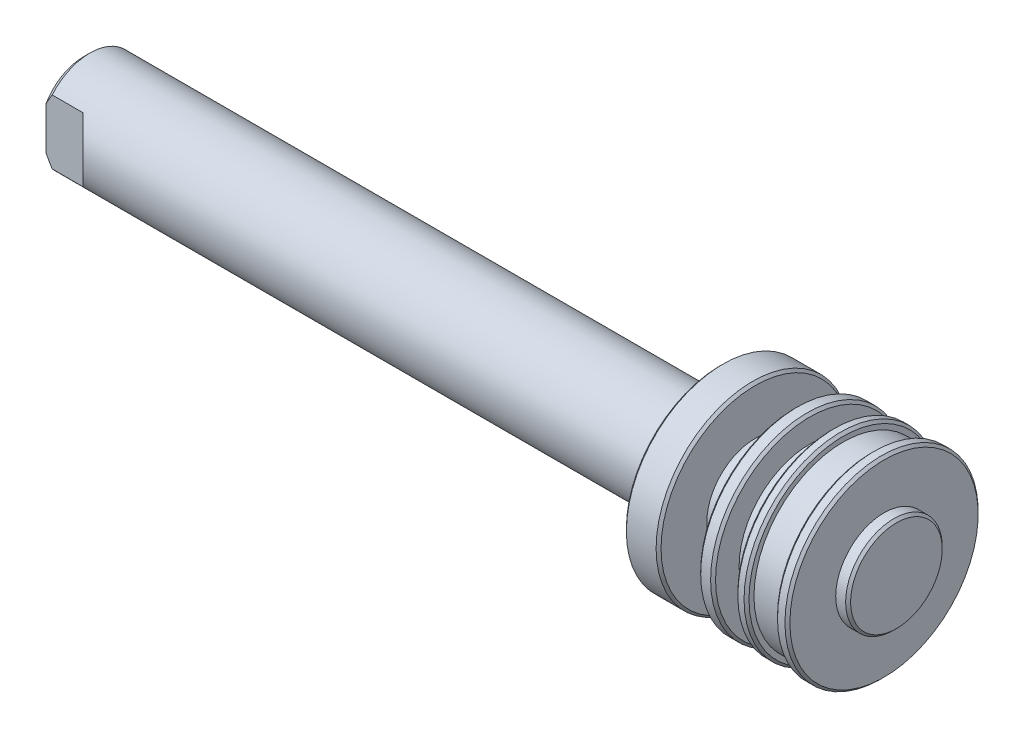
ISO-10303-21;
HEADER;
FILE_DESCRIPTION(('STEP AP214'),'2;1');
FILE_NAME('part.step','',(''),(''),'','','');
FILE_SCHEMA(('AUTOMOTIVE_DESIGN { 1 0 10303 214 1 1 1 1 }'));
ENDSEC;
DATA;
#1=APPLICATION_CONTEXT('core data for automotive mechanical design processes');
#2=APPLICATION_PROTOCOL_DEFINITION('international standard','automotive_design',2000,#1);
#3=PRODUCT_CONTEXT('',#1,'mechanical');
#4=PRODUCT('Part','Part','',(#3));
#5=PRODUCT_RELATED_PRODUCT_CATEGORY('part','',(#4));
#6=PRODUCT_DEFINITION_FORMATION('','',#4);
#7=PRODUCT_DEFINITION_CONTEXT('part definition',#1,'design');
#8=PRODUCT_DEFINITION('design','',#6,#7);
#9=PRODUCT_DEFINITION_SHAPE('','',#8);
#10=(LENGTH_UNIT() NAMED_UNIT(*) SI_UNIT(.MILLI.,.METRE.));
#11=(NAMED_UNIT(*) PLANE_ANGLE_UNIT() SI_UNIT($,.RADIAN.));
#12=(NAMED_UNIT(*) SI_UNIT($,.STERADIAN.) SOLID_ANGLE_UNIT());
#13=UNCERTAINTY_MEASURE_WITH_UNIT(LENGTH_MEASURE(1.E-05),#10,'distance_accuracy_value','');
#14=(GEOMETRIC_REPRESENTATION_CONTEXT(3) GLOBAL_UNCERTAINTY_ASSIGNED_CONTEXT((#13)) GLOBAL_UNIT_ASSIGNED_CONTEXT((#10,
#11,#12)) REPRESENTATION_CONTEXT('',''));
#15=CARTESIAN_POINT('',(0.,0.,0.));
#16=DIRECTION('',(0.,0.,1.));
#17=DIRECTION('',(1.,0.,0.));
#18=AXIS2_PLACEMENT_3D('',#15,#16,#17);
#19=CARTESIAN_POINT('',(0.5,0.,0.));
#20=DIRECTION('',(1.,0.,0.));
#21=DIRECTION('',(0.,0.,-1.));
#22=AXIS2_PLACEMENT_3D('',#19,#20,#21);
#23=CONICAL_SURFACE('',#22,4.,0.785398163397448);
#24=CARTESIAN_POINT('',(0.5,0.,0.));
#25=DIRECTION('',(-1.,0.,0.));
#26=DIRECTION('',(0.,0.,1.));
#27=AXIS2_PLACEMENT_3D('',#24,#25,#26);
#28=CIRCLE('',#27,4.);
#29=CARTESIAN_POINT('',(0.5,2.58795285892151,3.05));
#30=VERTEX_POINT('',#29);
#31=CARTESIAN_POINT('',(0.5,2.58795285892151,-3.05));
#32=VERTEX_POINT('',#31);
#33=EDGE_CURVE('E121',#30,#32,#28,.T.);
#34=ORIENTED_EDGE('',*,*,#33,.T.);
#35=CARTESIAN_POINT('',(5.30956586256442,8.26474141681761,-3.05));
#36=CARTESIAN_POINT('',(5.1887220072014,8.13592918825513,-3.05));
#37=CARTESIAN_POINT('',(5.06805590456024,8.00695029116973,-3.05));
#38=CARTESIAN_POINT('',(4.82713700916492,7.74860566830565,-3.05));
#39=CARTESIAN_POINT('',(4.70688421890468,7.61923994020161,-3.05));
#40=CARTESIAN_POINT('',(4.34668254667253,7.23032031117462,-3.05));
#41=CARTESIAN_POINT('',(4.10744372064438,6.97010714260211,-3.05));
#42=CARTESIAN_POINT('',(3.6261112271687,6.44136734403333,-3.05));
#43=CARTESIAN_POINT('',(3.38407702136471,6.17278651849577,-3.05));
#44=CARTESIAN_POINT('',(2.90395128456402,5.63236897410017,-3.05));
#45=CARTESIAN_POINT('',(2.66585766281513,5.36053412287958,-3.05));
#46=CARTESIAN_POINT('',(2.31305759431436,4.94914638399892,-3.05));
#47=CARTESIAN_POINT('',(2.19620240344148,4.81143730833098,-3.05));
#48=CARTESIAN_POINT('',(1.96429633510041,4.53451005363036,-3.05));
#49=CARTESIAN_POINT('',(1.84924541842636,4.39529190750042,-3.05));
#50=CARTESIAN_POINT('',(1.62122217730855,4.11474285751121,-3.05));
#51=CARTESIAN_POINT('',(1.50825396468045,3.97340860331652,-3.05));
#52=CARTESIAN_POINT('',(1.28529482129368,3.68841871284145,-3.05));
#53=CARTESIAN_POINT('',(1.17530367535827,3.54476324553896,-3.05));
#54=CARTESIAN_POINT('',(0.960215853154471,3.25580420295927,-3.05));
#55=CARTESIAN_POINT('',(0.855084309354178,3.1105267022285,-3.05));
#56=CARTESIAN_POINT('',(0.650011344775244,2.81624747105374,-3.05));
#57=CARTESIAN_POINT('',(0.550071770054458,2.66724444347886,-3.05));
#58=CARTESIAN_POINT('',(0.357760644144029,2.3650327263418,-3.05));
#59=CARTESIAN_POINT('',(0.265366949353805,2.21183824339981,-3.05));
#60=CARTESIAN_POINT('',(0.0909178818618186,1.89972186521963,-3.05));
#61=CARTESIAN_POINT('',(0.00885292811548895,1.74080545636814,-3.05));
#62=CARTESIAN_POINT('',(-0.10888824966213,1.48460423093103,-3.05));
#63=CARTESIAN_POINT('',(-0.149527231508398,1.38960764672698,-3.05));
#64=CARTESIAN_POINT('',(-0.224658879090396,1.19716828392364,-3.05));
#65=CARTESIAN_POINT('',(-0.259150663849781,1.09972515698105,-3.05));
#66=CARTESIAN_POINT('',(-0.32048596351761,0.903039491807728,-3.05));
#67=CARTESIAN_POINT('',(-0.34737197667197,0.803810385675026,-3.05));
#68=CARTESIAN_POINT('',(-0.392423615211038,0.603370922473285,-3.05));
#69=CARTESIAN_POINT('',(-0.410590228365179,0.502160791175531,-3.05));
#70=CARTESIAN_POINT('',(-0.437293875742596,0.296921109095727,-3.05));
#71=CARTESIAN_POINT('',(-0.445683831955525,0.192872010382581,-3.05));
#72=CARTESIAN_POINT('',(-0.451738886972855,-0.015532020052772,-3.05));
#73=CARTESIAN_POINT('',(-0.449405186963304,-0.119886916213197,-3.05));
#74=CARTESIAN_POINT('',(-0.434163616384527,-0.328142917325406,-3.05));
#75=CARTESIAN_POINT('',(-0.421221907885868,-0.432041498950139,-3.05));
#76=CARTESIAN_POINT('',(-0.385611014228022,-0.638154028171175,-3.05));
#77=CARTESIAN_POINT('',(-0.362938741525978,-0.740367430355252,-3.05));
#78=CARTESIAN_POINT('',(-0.300515697200884,-0.975090989055164,-3.05));
#79=CARTESIAN_POINT('',(-0.257616315421481,-1.10675758052918,-3.05));
#80=CARTESIAN_POINT('',(-0.160343187951011,-1.36574260352407,-3.05));
#81=CARTESIAN_POINT('',(-0.105963432616923,-1.49305871698072,-3.05));
#82=CARTESIAN_POINT('',(0.0121417829016161,-1.74504275639466,-3.05));
#83=CARTESIAN_POINT('',(0.0759687618859697,-1.86966253608835,-3.05));
#84=CARTESIAN_POINT('',(0.176680240883261,-2.05380294059511,-3.05));
#85=CARTESIAN_POINT('',(0.211074833355193,-2.11471109364415,-3.05));
#86=CARTESIAN_POINT('',(0.281315714507197,-2.23568154654843,-3.05));
#87=CARTESIAN_POINT('',(0.317161929863662,-2.29574388892078,-3.05));
#88=CARTESIAN_POINT('',(0.442625713747224,-2.50102337303096,-3.05));
#89=CARTESIAN_POINT('',(0.535355887995973,-2.64434046934043,-3.05));
#90=CARTESIAN_POINT('',(0.726222134731884,-2.92734432253532,-3.05));
#91=CARTESIAN_POINT('',(0.824359779428814,-3.06703000603559,-3.05));
#92=CARTESIAN_POINT('',(1.02472899255234,-3.34361521041407,-3.05));
#93=CARTESIAN_POINT('',(1.1269641842429,-3.48051209646423,-3.05));
#94=CARTESIAN_POINT('',(1.33448248137743,-3.75198214876369,-3.05));
#95=CARTESIAN_POINT('',(1.4397658184358,-3.88655513718389,-3.05));
#96=CARTESIAN_POINT('',(1.65312810266377,-4.15437191177198,-3.05));
#97=CARTESIAN_POINT('',(1.7612168044885,-4.28760790711467,-3.05));
#98=CARTESIAN_POINT('',(1.97927342309938,-4.55253520984487,-3.05));
#99=CARTESIAN_POINT('',(2.08924138879872,-4.68422647687552,-3.05));
#100=CARTESIAN_POINT('',(2.42125686291543,-5.07725906022321,-3.05));
#101=CARTESIAN_POINT('',(2.64553899162564,-5.33671172776797,-3.05));
#102=CARTESIAN_POINT('',(3.07144177080335,-5.82177568659465,-3.05));
#103=CARTESIAN_POINT('',(3.27262248447746,-6.04777570159472,-3.05));
#104=CARTESIAN_POINT('',(3.67730017858271,-6.4977550689543,-3.05));
#105=CARTESIAN_POINT('',(3.88079751655655,-6.72173409956867,-3.05));
#106=CARTESIAN_POINT('',(4.28779499659471,-7.16625348323241,-3.05));
#107=CARTESIAN_POINT('',(4.49128086968907,-7.38680692772714,-3.05));
#108=CARTESIAN_POINT('',(4.89953856942938,-7.82663982085206,-3.05));
#109=CARTESIAN_POINT('',(5.10431013366392,-8.04591951292631,-3.05));
#110=CARTESIAN_POINT('',(5.30956586256442,-8.26474141681761,-3.05));
#111=B_SPLINE_CURVE_WITH_KNOTS('',3,(#35,#36,#37,#38,#39,#40,#41,#42,#43,#44,#45,#46,#47,#48,
#49,#50,#51,#52,#53,#54,#55,#56,#57,#58,#59,#60,#61,#62,#63,#64,#65,#66,#67,#68,#69,#70,#71,#72,
#73,#74,#75,#76,#77,#78,#79,#80,#81,#82,#83,#84,#85,#86,#87,#88,#89,#90,#91,#92,#93,#94,#95,#96,
#97,#98,#99,#100,#101,#102,#103,#104,#105,#106,#107,#108,#109,#110),.UNSPECIFIED.,.F.,.F.,(4,2,
2,2,2,2,2,2,2,2,2,2,2,2,2,2,2,2,2,2,2,2,2,2,2,2,2,2,2,2,2,2,2,2,2,2,2,4),(0.,0.529869784554408,
1.05974276074664,2.12016049414461,3.20478023846264,4.28880477046128,4.8306145173731,
5.37241247470069,5.91518514336201,6.45791847611285,6.9958179420273,7.53390737270039,
8.07035634073656,8.60630396718082,8.91610909265289,9.22595858174228,9.53404091458944,
9.84208833836271,10.1547124660732,10.4673015767542,10.7808916973023,11.0945813947685,
11.5092899943203,11.9242162224943,12.3439774657782,12.5538079979439,12.7636279444488,
13.2755352885424,13.7875922620538,14.3001124693286,14.8126717233757,15.3273490695697,
15.8420398321721,16.8708335102401,17.7785331399435,18.6863748142993,19.5866207549675,
20.4866885687302),.UNSPECIFIED.);
#112=CARTESIAN_POINT('',(0.,1.71682847133894,-3.05));
#113=VERTEX_POINT('',#112);
#114=EDGE_CURVE('E106',#32,#113,#111,.T.);
#115=ORIENTED_EDGE('',*,*,#114,.T.);
#116=CARTESIAN_POINT('',(0.,0.,0.));
#117=DIRECTION('',(-1.,0.,0.));
#118=DIRECTION('',(0.,0.,1.));
#119=AXIS2_PLACEMENT_3D('',#116,#117,#118);
#120=CIRCLE('',#119,3.5);
#121=CARTESIAN_POINT('',(0.,1.71682847133894,3.05));
#122=VERTEX_POINT('',#121);
#123=EDGE_CURVE('E116',#122,#113,#120,.T.);
#124=ORIENTED_EDGE('',*,*,#123,.F.);
#125=CARTESIAN_POINT('',(5.30956586256442,-8.26474141681761,3.05));
#126=CARTESIAN_POINT('',(5.1887220072014,-8.13592918825513,3.05));
#127=CARTESIAN_POINT('',(5.06805590456024,-8.00695029116973,3.05));
#128=CARTESIAN_POINT('',(4.82713700916492,-7.74860566830565,3.05));
#129=CARTESIAN_POINT('',(4.70688421890468,-7.61923994020161,3.05));
#130=CARTESIAN_POINT('',(4.34668254667253,-7.23032031117462,3.05));
#131=CARTESIAN_POINT('',(4.10744372064438,-6.97010714260211,3.05));
#132=CARTESIAN_POINT('',(3.6261112271687,-6.44136734403333,3.05));
#133=CARTESIAN_POINT('',(3.38407702136471,-6.17278651849577,3.05));
#134=CARTESIAN_POINT('',(2.90395128456402,-5.63236897410017,3.05));
#135=CARTESIAN_POINT('',(2.66585766281513,-5.36053412287958,3.05));
#136=CARTESIAN_POINT('',(2.31305759431436,-4.94914638399892,3.05));
#137=CARTESIAN_POINT('',(2.19620240344148,-4.81143730833098,3.05));
#138=CARTESIAN_POINT('',(1.96429633510041,-4.53451005363036,3.05));
#139=CARTESIAN_POINT('',(1.84924541842636,-4.39529190750042,3.05));
#140=CARTESIAN_POINT('',(1.62122217730855,-4.11474285751121,3.05));
#141=CARTESIAN_POINT('',(1.50825396468045,-3.97340860331652,3.05));
#142=CARTESIAN_POINT('',(1.28529482129368,-3.68841871284145,3.05));
#143=CARTESIAN_POINT('',(1.17530367535827,-3.54476324553896,3.05));
#144=CARTESIAN_POINT('',(0.960215853154471,-3.25580420295927,3.05));
#145=CARTESIAN_POINT('',(0.855084309354178,-3.1105267022285,3.05));
#146=CARTESIAN_POINT('',(0.650011344775244,-2.81624747105374,3.05));
#147=CARTESIAN_POINT('',(0.550071770054458,-2.66724444347886,3.05));
#148=CARTESIAN_POINT('',(0.357760644144029,-2.3650327263418,3.05));
#149=CARTESIAN_POINT('',(0.265366949353805,-2.21183824339981,3.05));
#150=CARTESIAN_POINT('',(0.0909178818618186,-1.89972186521963,3.05));
#151=CARTESIAN_POINT('',(0.00885292811548895,-1.74080545636814,3.05));
#152=CARTESIAN_POINT('',(-0.10888824966213,-1.48460423093103,3.05));
#153=CARTESIAN_POINT('',(-0.149527231508398,-1.38960764672698,3.05));
#154=CARTESIAN_POINT('',(-0.224658879090396,-1.19716828392364,3.05));
#155=CARTESIAN_POINT('',(-0.259150663849781,-1.09972515698105,3.05));
#156=CARTESIAN_POINT('',(-0.32048596351761,-0.903039491807728,3.05));
#157=CARTESIAN_POINT('',(-0.34737197667197,-0.803810385675026,3.05));
#158=CARTESIAN_POINT('',(-0.392423615211038,-0.603370922473285,3.05));
#159=CARTESIAN_POINT('',(-0.410590228365179,-0.502160791175531,3.05));
#160=CARTESIAN_POINT('',(-0.437293875742596,-0.296921109095727,3.05));
#161=CARTESIAN_POINT('',(-0.445683831955525,-0.192872010382581,3.05));
#162=CARTESIAN_POINT('',(-0.451738886972855,0.015532020052772,3.05));
#163=CARTESIAN_POINT('',(-0.449405186963304,0.119886916213197,3.05));
#164=CARTESIAN_POINT('',(-0.434163616384527,0.328142917325406,3.05));
#165=CARTESIAN_POINT('',(-0.421221907885868,0.432041498950139,3.05));
#166=CARTESIAN_POINT('',(-0.385611014228022,0.638154028171175,3.05));
#167=CARTESIAN_POINT('',(-0.362938741525978,0.740367430355252,3.05));
#168=CARTESIAN_POINT('',(-0.300515697200884,0.975090989055164,3.05));
#169=CARTESIAN_POINT('',(-0.257616315421481,1.10675758052918,3.05));
#170=CARTESIAN_POINT('',(-0.160343187951011,1.36574260352407,3.05));
#171=CARTESIAN_POINT('',(-0.105963432616923,1.49305871698072,3.05));
#172=CARTESIAN_POINT('',(0.0121417829016161,1.74504275639466,3.05));
#173=CARTESIAN_POINT('',(0.0759687618859697,1.86966253608835,3.05));
#174=CARTESIAN_POINT('',(0.176680240883261,2.05380294059511,3.05));
#175=CARTESIAN_POINT('',(0.211074833355193,2.11471109364415,3.05));
#176=CARTESIAN_POINT('',(0.281315714507197,2.23568154654843,3.05));
#177=CARTESIAN_POINT('',(0.317161929863662,2.29574388892078,3.05));
#178=CARTESIAN_POINT('',(0.442625713747224,2.50102337303096,3.05));
#179=CARTESIAN_POINT('',(0.535355887995973,2.64434046934043,3.05));
#180=CARTESIAN_POINT('',(0.726222134731884,2.92734432253532,3.05));
#181=CARTESIAN_POINT('',(0.824359779428814,3.06703000603559,3.05));
#182=CARTESIAN_POINT('',(1.02472899255234,3.34361521041407,3.05));
#183=CARTESIAN_POINT('',(1.1269641842429,3.48051209646423,3.05));
#184=CARTESIAN_POINT('',(1.33448248137743,3.75198214876369,3.05));
#185=CARTESIAN_POINT('',(1.4397658184358,3.88655513718389,3.05));
#186=CARTESIAN_POINT('',(1.65312810266377,4.15437191177198,3.05));
#187=CARTESIAN_POINT('',(1.7612168044885,4.28760790711467,3.05));
#188=CARTESIAN_POINT('',(1.97927342309938,4.55253520984487,3.05));
#189=CARTESIAN_POINT('',(2.08924138879872,4.68422647687552,3.05));
#190=CARTESIAN_POINT('',(2.42125686291543,5.07725906022321,3.05));
#191=CARTESIAN_POINT('',(2.64553899162564,5.33671172776797,3.05));
#192=CARTESIAN_POINT('',(3.07144177080335,5.82177568659465,3.05));
#193=CARTESIAN_POINT('',(3.27262248447746,6.04777570159472,3.05));
#194=CARTESIAN_POINT('',(3.67730017858271,6.4977550689543,3.05));
#195=CARTESIAN_POINT('',(3.88079751655655,6.72173409956867,3.05));
#196=CARTESIAN_POINT('',(4.28779499659471,7.16625348323241,3.05));
#197=CARTESIAN_POINT('',(4.49128086968907,7.38680692772714,3.05));
#198=CARTESIAN_POINT('',(4.89953856942938,7.82663982085206,3.05));
#199=CARTESIAN_POINT('',(5.10431013366392,8.04591951292631,3.05));
#200=CARTESIAN_POINT('',(5.30956586256442,8.26474141681761,3.05));
#201=B_SPLINE_CURVE_WITH_KNOTS('',3,(#125,#126,#127,#128,#129,#130,#131,#132,#133,#134,#135,
#136,#137,#138,#139,#140,#141,#142,#143,#144,#145,#146,#147,#148,#149,#150,#151,#152,#153,#154,
#155,#156,#157,#158,#159,#160,#161,#162,#163,#164,#165,#166,#167,#168,#169,#170,#171,#172,#173,
#174,#175,#176,#177,#178,#179,#180,#181,#182,#183,#184,#185,#186,#187,#188,#189,#190,#191,#192,
#193,#194,#195,#196,#197,#198,#199,#200),.UNSPECIFIED.,.F.,.F.,(4,2,2,2,2,2,2,2,2,2,2,2,2,2,2,2,
2,2,2,2,2,2,2,2,2,2,2,2,2,2,2,2,2,2,2,2,2,4),(0.,0.529869784554408,1.05974276074664,
2.12016049414461,3.20478023846264,4.28880477046128,4.8306145173731,5.37241247470069,
5.91518514336201,6.45791847611285,6.9958179420273,7.53390737270039,8.07035634073656,
8.60630396718082,8.91610909265289,9.22595858174228,9.53404091458944,9.84208833836271,
10.1547124660732,10.4673015767542,10.7808916973023,11.0945813947685,11.5092899943203,
11.9242162224943,12.3439774657782,12.5538079979439,12.7636279444488,13.2755352885424,
13.7875922620538,14.3001124693286,14.8126717233757,15.3273490695697,15.8420398321721,
16.8708335102401,17.7785331399435,18.6863748142993,19.5866207549675,20.4866885687302),.UNSPECIFIED.);
#202=EDGE_CURVE('E144',#122,#30,#201,.T.);
#203=ORIENTED_EDGE('',*,*,#202,.T.);
#204=EDGE_LOOP('',(#34,#115,#124,#203));
#205=FACE_BOUND('',#204,.T.);
#206=ADVANCED_FACE('F41',(#205),#23,.T.);
#207=CARTESIAN_POINT('',(0.,0.,0.));
#208=DIRECTION('',(1.,0.,0.));
#209=DIRECTION('',(0.,0.,-1.));
#210=AXIS2_PLACEMENT_3D('',#207,#208,#209);
#211=PLANE('',#210);
#212=ORIENTED_EDGE('',*,*,#123,.T.);
#213=DIRECTION('',(0.,1.,0.));
#214=VECTOR('',#213,1.);
#215=CARTESIAN_POINT('',(0.,-8.,-3.05));
#216=LINE('',#215,#214);
#217=CARTESIAN_POINT('',(0.,-1.71682847133894,-3.05));
#218=VERTEX_POINT('',#217);
#219=EDGE_CURVE('E98',#218,#113,#216,.T.);
#220=ORIENTED_EDGE('',*,*,#219,.F.);
#221=CARTESIAN_POINT('',(0.,-1.71682847133894,3.05));
#222=VERTEX_POINT('',#221);
#223=EDGE_CURVE('E114',#218,#222,#120,.T.);
#224=ORIENTED_EDGE('',*,*,#223,.T.);
#225=DIRECTION('',(0.,1.,0.));
#226=VECTOR('',#225,1.);
#227=CARTESIAN_POINT('',(0.,-8.,3.05));
#228=LINE('',#227,#226);
#229=EDGE_CURVE('E117',#222,#122,#228,.T.);
#230=ORIENTED_EDGE('',*,*,#229,.T.);
#231=EDGE_LOOP('',(#212,#220,#224,#230));
#232=FACE_BOUND('',#231,.T.);
#233=CARTESIAN_POINT('',(0.,0.,0.));
#234=DIRECTION('',(-1.,0.,0.));
#235=DIRECTION('',(0.,-1.,0.));
#236=AXIS2_PLACEMENT_3D('',#233,#234,#235);
#237=CIRCLE('',#236,2.);
#238=CARTESIAN_POINT('',(0.,-2.,0.));
#239=VERTEX_POINT('',#238);
#240=EDGE_CURVE('E374',#239,#239,#237,.T.);
#241=ORIENTED_EDGE('',*,*,#240,.F.);
#242=EDGE_LOOP('',(#241));
#243=FACE_BOUND('',#242,.T.);
#244=ADVANCED_FACE('F43',(#232,#243),#211,.F.);
#245=ORIENTED_EDGE('',*,*,#223,.F.);
#246=CARTESIAN_POINT('',(0.5,-2.58795285892151,-3.05));
#247=VERTEX_POINT('',#246);
#248=EDGE_CURVE('E95',#218,#247,#111,.T.);
#249=ORIENTED_EDGE('',*,*,#248,.T.);
#250=CARTESIAN_POINT('',(0.5,-2.58795285892151,3.05));
#251=VERTEX_POINT('',#250);
#252=EDGE_CURVE('E125',#247,#251,#28,.T.);
#253=ORIENTED_EDGE('',*,*,#252,.T.);
#254=EDGE_CURVE('E107',#251,#222,#201,.T.);
#255=ORIENTED_EDGE('',*,*,#254,.T.);
#256=EDGE_LOOP('',(#245,#249,#253,#255));
#257=FACE_BOUND('',#256,.T.);
#258=ADVANCED_FACE('F120',(#257),#23,.T.);
#259=CARTESIAN_POINT('',(65.6,0.,0.));
#260=DIRECTION('',(-1.,0.,0.));
#261=DIRECTION('',(0.,0.,1.));
#262=AXIS2_PLACEMENT_3D('',#259,#260,#261);
#263=CYLINDRICAL_SURFACE('',#262,4.);
#264=CARTESIAN_POINT('',(-0.0499999999999945,0.,0.));
#265=DIRECTION('',(0.707106781186547,0.,0.707106781186547));
#266=DIRECTION('',(-0.707106781186548,0.,0.707106781186548));
#267=AXIS2_PLACEMENT_3D('',#264,#265,#266);
#268=ELLIPSE('',#267,5.65685424949238,4.);
#269=CARTESIAN_POINT('',(3.,-2.58795285892151,-3.05));
#270=VERTEX_POINT('',#269);
#271=CARTESIAN_POINT('',(3.,2.58795285892151,-3.05));
#272=VERTEX_POINT('',#271);
#273=EDGE_CURVE('E49',#270,#272,#268,.T.);
#274=ORIENTED_EDGE('',*,*,#273,.T.);
#275=DIRECTION('',(-1.,0.,0.));
#276=VECTOR('',#275,1.);
#277=CARTESIAN_POINT('',(65.6,2.58795285892151,-3.05));
#278=LINE('',#277,#276);
#279=EDGE_CURVE('E11',#272,#32,#278,.T.);
#280=ORIENTED_EDGE('',*,*,#279,.T.);
#281=ORIENTED_EDGE('',*,*,#33,.F.);
#282=DIRECTION('',(-1.,0.,0.));
#283=VECTOR('',#282,1.);
#284=CARTESIAN_POINT('',(65.6,2.58795285892151,3.05));
#285=LINE('',#284,#283);
#286=CARTESIAN_POINT('',(3.,2.58795285892151,3.05));
#287=VERTEX_POINT('',#286);
#288=EDGE_CURVE('E131',#30,#287,#285,.F.);
#289=ORIENTED_EDGE('',*,*,#288,.T.);
#290=CARTESIAN_POINT('',(-0.0499999999999945,0.,0.));
#291=DIRECTION('',(0.707106781186547,0.,-0.707106781186548));
#292=DIRECTION('',(-0.707106781186548,0.,-0.707106781186547));
#293=AXIS2_PLACEMENT_3D('',#290,#291,#292);
#294=ELLIPSE('',#293,5.65685424949238,4.);
#295=CARTESIAN_POINT('',(3.,-2.58795285892151,3.05));
#296=VERTEX_POINT('',#295);
#297=EDGE_CURVE('E123',#287,#296,#294,.T.);
#298=ORIENTED_EDGE('',*,*,#297,.T.);
#299=DIRECTION('',(-1.,0.,0.));
#300=VECTOR('',#299,1.);
#301=CARTESIAN_POINT('',(65.6,-2.58795285892151,3.05));
#302=LINE('',#301,#300);
#303=EDGE_CURVE('E134',#296,#251,#302,.T.);
#304=ORIENTED_EDGE('',*,*,#303,.T.);
#305=ORIENTED_EDGE('',*,*,#252,.F.);
#306=DIRECTION('',(-1.,0.,0.));
#307=VECTOR('',#306,1.);
#308=CARTESIAN_POINT('',(65.6,-2.58795285892151,-3.05));
#309=LINE('',#308,#307);
#310=EDGE_CURVE('E101',#247,#270,#309,.F.);
#311=ORIENTED_EDGE('',*,*,#310,.T.);
#312=EDGE_LOOP('',(#274,#280,#281,#289,#298,#304,#305,#311));
#313=FACE_BOUND('',#312,.T.);
#314=CARTESIAN_POINT('',(51.4,0.,0.));
#315=DIRECTION('',(-1.,0.,0.));
#316=DIRECTION('',(0.,0.,1.));
#317=AXIS2_PLACEMENT_3D('',#314,#315,#316);
#318=CIRCLE('',#317,4.);
#319=CARTESIAN_POINT('',(51.4,0.,4.));
#320=VERTEX_POINT('',#319);
#321=EDGE_CURVE('E295',#320,#320,#318,.T.);
#322=ORIENTED_EDGE('',*,*,#321,.T.);
#323=EDGE_LOOP('',(#322));
#324=FACE_BOUND('',#323,.T.);
#325=ADVANCED_FACE('F139',(#313,#324),#263,.T.);
#326=CARTESIAN_POINT('',(51.4,4.,0.));
#327=DIRECTION('',(1.,0.,0.));
#328=DIRECTION('',(0.,0.,-1.));
#329=AXIS2_PLACEMENT_3D('',#326,#327,#328);
#330=PLANE('',#329);
#331=ORIENTED_EDGE('',*,*,#321,.F.);
#332=EDGE_LOOP('',(#331));
#333=FACE_BOUND('',#332,.T.);
#334=CARTESIAN_POINT('',(51.4,0.,0.));
#335=DIRECTION('',(-1.,0.,0.));
#336=DIRECTION('',(0.,0.,1.));
#337=AXIS2_PLACEMENT_3D('',#334,#335,#336);
#338=CIRCLE('',#337,7.6);
#339=CARTESIAN_POINT('',(51.4,0.,7.6));
#340=VERTEX_POINT('',#339);
#341=EDGE_CURVE('E297',#340,#340,#338,.T.);
#342=ORIENTED_EDGE('',*,*,#341,.T.);
#343=EDGE_LOOP('',(#342));
#344=FACE_BOUND('',#343,.T.);
#345=ADVANCED_FACE('F282',(#333,#344),#330,.F.);
#346=CARTESIAN_POINT('',(51.6,0.,0.));
#347=DIRECTION('',(1.,0.,0.));
#348=DIRECTION('',(0.,0.,-1.));
#349=AXIS2_PLACEMENT_3D('',#346,#347,#348);
#350=CONICAL_SURFACE('',#349,7.8,0.78539816339745);
#351=ORIENTED_EDGE('',*,*,#341,.F.);
#352=EDGE_LOOP('',(#351));
#353=FACE_BOUND('',#352,.T.);
#354=CARTESIAN_POINT('',(51.6,0.,0.));
#355=DIRECTION('',(-1.,0.,0.));
#356=DIRECTION('',(0.,0.,1.));
#357=AXIS2_PLACEMENT_3D('',#354,#355,#356);
#358=CIRCLE('',#357,7.8);
#359=CARTESIAN_POINT('',(51.6,0.,7.8));
#360=VERTEX_POINT('',#359);
#361=EDGE_CURVE('E300',#360,#360,#358,.T.);
#362=ORIENTED_EDGE('',*,*,#361,.T.);
#363=EDGE_LOOP('',(#362));
#364=FACE_BOUND('',#363,.T.);
#365=ADVANCED_FACE('F278',(#353,#364),#350,.T.);
#366=CARTESIAN_POINT('',(65.6,0.,0.));
#367=DIRECTION('',(-1.,0.,0.));
#368=DIRECTION('',(0.,0.,1.));
#369=AXIS2_PLACEMENT_3D('',#366,#367,#368);
#370=CYLINDRICAL_SURFACE('',#369,7.8);
#371=ORIENTED_EDGE('',*,*,#361,.F.);
#372=EDGE_LOOP('',(#371));
#373=FACE_BOUND('',#372,.T.);
#374=CARTESIAN_POINT('',(54.,0.,0.));
#375=DIRECTION('',(-1.,0.,0.));
#376=DIRECTION('',(0.,0.,1.));
#377=AXIS2_PLACEMENT_3D('',#374,#375,#376);
#378=CIRCLE('',#377,7.8);
#379=CARTESIAN_POINT('',(54.,0.,7.8));
#380=VERTEX_POINT('',#379);
#381=EDGE_CURVE('E305',#380,#380,#378,.T.);
#382=ORIENTED_EDGE('',*,*,#381,.T.);
#383=EDGE_LOOP('',(#382));
#384=FACE_BOUND('',#383,.T.);
#385=ADVANCED_FACE('F274',(#373,#384),#370,.T.);
#386=CARTESIAN_POINT('',(54.2,0.,0.));
#387=DIRECTION('',(-1.,0.,0.));
#388=DIRECTION('',(0.,0.,1.));
#389=AXIS2_PLACEMENT_3D('',#386,#387,#388);
#390=CONICAL_SURFACE('',#389,7.6,0.785398163397433);
#391=ORIENTED_EDGE('',*,*,#381,.F.);
#392=EDGE_LOOP('',(#391));
#393=FACE_BOUND('',#392,.T.);
#394=CARTESIAN_POINT('',(54.2,0.,0.));
#395=DIRECTION('',(-1.,0.,0.));
#396=DIRECTION('',(0.,0.,1.));
#397=AXIS2_PLACEMENT_3D('',#394,#395,#396);
#398=CIRCLE('',#397,7.6);
#399=CARTESIAN_POINT('',(54.2,0.,7.6));
#400=VERTEX_POINT('',#399);
#401=EDGE_CURVE('E308',#400,#400,#398,.T.);
#402=ORIENTED_EDGE('',*,*,#401,.T.);
#403=EDGE_LOOP('',(#402));
#404=FACE_BOUND('',#403,.T.);
#405=ADVANCED_FACE('F270',(#393,#404),#390,.T.);
#406=CARTESIAN_POINT('',(54.2,7.6,0.));
#407=DIRECTION('',(-1.,0.,0.));
#408=DIRECTION('',(0.,0.,1.));
#409=AXIS2_PLACEMENT_3D('',#406,#407,#408);
#410=PLANE('',#409);
#411=ORIENTED_EDGE('',*,*,#401,.F.);
#412=EDGE_LOOP('',(#411));
#413=FACE_BOUND('',#412,.T.);
#414=CARTESIAN_POINT('',(54.2,0.,0.));
#415=DIRECTION('',(-1.,0.,0.));
#416=DIRECTION('',(0.,0.,1.));
#417=AXIS2_PLACEMENT_3D('',#414,#415,#416);
#418=CIRCLE('',#417,3.9);
#419=CARTESIAN_POINT('',(54.2,0.,3.9));
#420=VERTEX_POINT('',#419);
#421=EDGE_CURVE('E311',#420,#420,#418,.T.);
#422=ORIENTED_EDGE('',*,*,#421,.T.);
#423=EDGE_LOOP('',(#422));
#424=FACE_BOUND('',#423,.T.);
#425=ADVANCED_FACE('F266',(#413,#424),#410,.F.);
#426=CARTESIAN_POINT('',(65.6,0.,0.));
#427=DIRECTION('',(-1.,0.,0.));
#428=DIRECTION('',(0.,0.,1.));
#429=AXIS2_PLACEMENT_3D('',#426,#427,#428);
#430=CYLINDRICAL_SURFACE('',#429,3.9);
#431=ORIENTED_EDGE('',*,*,#421,.F.);
#432=EDGE_LOOP('',(#431));
#433=FACE_BOUND('',#432,.T.);
#434=CARTESIAN_POINT('',(57.4,0.,0.));
#435=DIRECTION('',(-1.,0.,0.));
#436=DIRECTION('',(0.,0.,1.));
#437=AXIS2_PLACEMENT_3D('',#434,#435,#436);
#438=CIRCLE('',#437,3.9);
#439=CARTESIAN_POINT('',(57.4,0.,3.9));
#440=VERTEX_POINT('',#439);
#441=EDGE_CURVE('E314',#440,#440,#438,.T.);
#442=ORIENTED_EDGE('',*,*,#441,.T.);
#443=EDGE_LOOP('',(#442));
#444=FACE_BOUND('',#443,.T.);
#445=ADVANCED_FACE('F262',(#433,#444),#430,.T.);
#446=CARTESIAN_POINT('',(57.4,3.9,0.));
#447=DIRECTION('',(1.,0.,0.));
#448=DIRECTION('',(0.,0.,-1.));
#449=AXIS2_PLACEMENT_3D('',#446,#447,#448);
#450=PLANE('',#449);
#451=ORIENTED_EDGE('',*,*,#441,.F.);
#452=EDGE_LOOP('',(#451));
#453=FACE_BOUND('',#452,.T.);
#454=CARTESIAN_POINT('',(57.4,0.,0.));
#455=DIRECTION('',(-1.,0.,0.));
#456=DIRECTION('',(0.,0.,1.));
#457=AXIS2_PLACEMENT_3D('',#454,#455,#456);
#458=CIRCLE('',#457,7.6);
#459=CARTESIAN_POINT('',(57.4,0.,7.6));
#460=VERTEX_POINT('',#459);
#461=EDGE_CURVE('E317',#460,#460,#458,.T.);
#462=ORIENTED_EDGE('',*,*,#461,.T.);
#463=EDGE_LOOP('',(#462));
#464=FACE_BOUND('',#463,.T.);
#465=ADVANCED_FACE('F258',(#453,#464),#450,.F.);
#466=CARTESIAN_POINT('',(57.6,0.,0.));
#467=DIRECTION('',(1.,0.,0.));
#468=DIRECTION('',(0.,0.,-1.));
#469=AXIS2_PLACEMENT_3D('',#466,#467,#468);
#470=CONICAL_SURFACE('',#469,7.8,0.785398163397433);
#471=ORIENTED_EDGE('',*,*,#461,.F.);
#472=EDGE_LOOP('',(#471));
#473=FACE_BOUND('',#472,.T.);
#474=CARTESIAN_POINT('',(57.6,0.,0.));
#475=DIRECTION('',(-1.,0.,0.));
#476=DIRECTION('',(0.,0.,1.));
#477=AXIS2_PLACEMENT_3D('',#474,#475,#476);
#478=CIRCLE('',#477,7.8);
#479=CARTESIAN_POINT('',(57.6,0.,7.8));
#480=VERTEX_POINT('',#479);
#481=EDGE_CURVE('E320',#480,#480,#478,.T.);
#482=ORIENTED_EDGE('',*,*,#481,.T.);
#483=EDGE_LOOP('',(#482));
#484=FACE_BOUND('',#483,.T.);
#485=ADVANCED_FACE('F254',(#473,#484),#470,.T.);
#486=CARTESIAN_POINT('',(65.6,0.,0.));
#487=DIRECTION('',(-1.,0.,0.));
#488=DIRECTION('',(0.,0.,1.));
#489=AXIS2_PLACEMENT_3D('',#486,#487,#488);
#490=CYLINDRICAL_SURFACE('',#489,7.8);
#491=ORIENTED_EDGE('',*,*,#481,.F.);
#492=EDGE_LOOP('',(#491));
#493=FACE_BOUND('',#492,.T.);
#494=CARTESIAN_POINT('',(58.4,0.,0.));
#495=DIRECTION('',(-1.,0.,0.));
#496=DIRECTION('',(0.,0.,1.));
#497=AXIS2_PLACEMENT_3D('',#494,#495,#496);
#498=CIRCLE('',#497,7.8);
#499=CARTESIAN_POINT('',(58.4,0.,7.8));
#500=VERTEX_POINT('',#499);
#501=EDGE_CURVE('E323',#500,#500,#498,.T.);
#502=ORIENTED_EDGE('',*,*,#501,.T.);
#503=EDGE_LOOP('',(#502));
#504=FACE_BOUND('',#503,.T.);
#505=ADVANCED_FACE('F250',(#493,#504),#490,.T.);
#506=CARTESIAN_POINT('',(58.6,0.,0.));
#507=DIRECTION('',(-1.,0.,0.));
#508=DIRECTION('',(0.,0.,1.));
#509=AXIS2_PLACEMENT_3D('',#506,#507,#508);
#510=CONICAL_SURFACE('',#509,7.6,0.78539816339745);
#511=ORIENTED_EDGE('',*,*,#501,.F.);
#512=EDGE_LOOP('',(#511));
#513=FACE_BOUND('',#512,.T.);
#514=CARTESIAN_POINT('',(58.6,0.,0.));
#515=DIRECTION('',(-1.,0.,0.));
#516=DIRECTION('',(0.,0.,1.));
#517=AXIS2_PLACEMENT_3D('',#514,#515,#516);
#518=CIRCLE('',#517,7.6);
#519=CARTESIAN_POINT('',(58.6,0.,7.6));
#520=VERTEX_POINT('',#519);
#521=EDGE_CURVE('E326',#520,#520,#518,.T.);
#522=ORIENTED_EDGE('',*,*,#521,.T.);
#523=EDGE_LOOP('',(#522));
#524=FACE_BOUND('',#523,.T.);
#525=ADVANCED_FACE('F246',(#513,#524),#510,.T.);
#526=CARTESIAN_POINT('',(58.6,7.6,0.));
#527=DIRECTION('',(-1.,0.,0.));
#528=DIRECTION('',(0.,0.,1.));
#529=AXIS2_PLACEMENT_3D('',#526,#527,#528);
#530=PLANE('',#529);
#531=ORIENTED_EDGE('',*,*,#521,.F.);
#532=EDGE_LOOP('',(#531));
#533=FACE_BOUND('',#532,.T.);
#534=CARTESIAN_POINT('',(58.6,0.,0.));
#535=DIRECTION('',(-1.,0.,0.));
#536=DIRECTION('',(0.,0.,1.));
#537=AXIS2_PLACEMENT_3D('',#534,#535,#536);
#538=CIRCLE('',#537,5.7);
#539=CARTESIAN_POINT('',(58.6,0.,5.7));
#540=VERTEX_POINT('',#539);
#541=EDGE_CURVE('E329',#540,#540,#538,.T.);
#542=ORIENTED_EDGE('',*,*,#541,.T.);
#543=EDGE_LOOP('',(#542));
#544=FACE_BOUND('',#543,.T.);
#545=ADVANCED_FACE('F242',(#533,#544),#530,.F.);
#546=CARTESIAN_POINT('',(65.6,0.,0.));
#547=DIRECTION('',(-1.,0.,0.));
#548=DIRECTION('',(0.,0.,1.));
#549=AXIS2_PLACEMENT_3D('',#546,#547,#548);
#550=CYLINDRICAL_SURFACE('',#549,5.7);
#551=ORIENTED_EDGE('',*,*,#541,.F.);
#552=EDGE_LOOP('',(#551));
#553=FACE_BOUND('',#552,.T.);
#554=CARTESIAN_POINT('',(60.4,0.,0.));
#555=DIRECTION('',(-1.,0.,0.));
#556=DIRECTION('',(0.,0.,1.));
#557=AXIS2_PLACEMENT_3D('',#554,#555,#556);
#558=CIRCLE('',#557,5.7);
#559=CARTESIAN_POINT('',(60.4,0.,5.7));
#560=VERTEX_POINT('',#559);
#561=EDGE_CURVE('E332',#560,#560,#558,.T.);
#562=ORIENTED_EDGE('',*,*,#561,.T.);
#563=EDGE_LOOP('',(#562));
#564=FACE_BOUND('',#563,.T.);
#565=ADVANCED_FACE('F238',(#553,#564),#550,.T.);
#566=CARTESIAN_POINT('',(60.4,5.7,0.));
#567=DIRECTION('',(1.,0.,0.));
#568=DIRECTION('',(0.,0.,-1.));
#569=AXIS2_PLACEMENT_3D('',#566,#567,#568);
#570=PLANE('',#569);
#571=ORIENTED_EDGE('',*,*,#561,.F.);
#572=EDGE_LOOP('',(#571));
#573=FACE_BOUND('',#572,.T.);
#574=CARTESIAN_POINT('',(60.4,0.,0.));
#575=DIRECTION('',(-1.,0.,0.));
#576=DIRECTION('',(0.,0.,1.));
#577=AXIS2_PLACEMENT_3D('',#574,#575,#576);
#578=CIRCLE('',#577,7.6);
#579=CARTESIAN_POINT('',(60.4,0.,7.6));
#580=VERTEX_POINT('',#579);
#581=EDGE_CURVE('E335',#580,#580,#578,.T.);
#582=ORIENTED_EDGE('',*,*,#581,.T.);
#583=EDGE_LOOP('',(#582));
#584=FACE_BOUND('',#583,.T.);
#585=ADVANCED_FACE('F234',(#573,#584),#570,.F.);
#586=CARTESIAN_POINT('',(60.6,0.,0.));
#587=DIRECTION('',(1.,0.,0.));
#588=DIRECTION('',(0.,0.,-1.));
#589=AXIS2_PLACEMENT_3D('',#586,#587,#588);
#590=CONICAL_SURFACE('',#589,7.8,0.78539816339745);
#591=ORIENTED_EDGE('',*,*,#581,.F.);
#592=EDGE_LOOP('',(#591));
#593=FACE_BOUND('',#592,.T.);
#594=CARTESIAN_POINT('',(60.6,0.,0.));
#595=DIRECTION('',(-1.,0.,0.));
#596=DIRECTION('',(0.,0.,1.));
#597=AXIS2_PLACEMENT_3D('',#594,#595,#596);
#598=CIRCLE('',#597,7.8);
#599=CARTESIAN_POINT('',(60.6,0.,7.8));
#600=VERTEX_POINT('',#599);
#601=EDGE_CURVE('E338',#600,#600,#598,.T.);
#602=ORIENTED_EDGE('',*,*,#601,.T.);
#603=EDGE_LOOP('',(#602));
#604=FACE_BOUND('',#603,.T.);
#605=ADVANCED_FACE('F230',(#593,#604),#590,.T.);
#606=CARTESIAN_POINT('',(65.6,0.,0.));
#607=DIRECTION('',(-1.,0.,0.));
#608=DIRECTION('',(0.,0.,1.));
#609=AXIS2_PLACEMENT_3D('',#606,#607,#608);
#610=CYLINDRICAL_SURFACE('',#609,7.8);
#611=ORIENTED_EDGE('',*,*,#601,.F.);
#612=EDGE_LOOP('',(#611));
#613=FACE_BOUND('',#612,.T.);
#614=CARTESIAN_POINT('',(61.1,0.,0.));
#615=DIRECTION('',(-1.,0.,0.));
#616=DIRECTION('',(0.,0.,1.));
#617=AXIS2_PLACEMENT_3D('',#614,#615,#616);
#618=CIRCLE('',#617,7.8);
#619=CARTESIAN_POINT('',(61.1,0.,7.8));
#620=VERTEX_POINT('',#619);
#621=EDGE_CURVE('E341',#620,#620,#618,.T.);
#622=ORIENTED_EDGE('',*,*,#621,.T.);
#623=EDGE_LOOP('',(#622));
#624=FACE_BOUND('',#623,.T.);
#625=ADVANCED_FACE('F226',(#613,#624),#610,.T.);
#626=CARTESIAN_POINT('',(61.3,0.,0.));
#627=DIRECTION('',(-1.,0.,0.));
#628=DIRECTION('',(0.,0.,1.));
#629=AXIS2_PLACEMENT_3D('',#626,#627,#628);
#630=CONICAL_SURFACE('',#629,7.6,0.785398163397433);
#631=ORIENTED_EDGE('',*,*,#621,.F.);
#632=EDGE_LOOP('',(#631));
#633=FACE_BOUND('',#632,.T.);
#634=CARTESIAN_POINT('',(61.3,0.,0.));
#635=DIRECTION('',(-1.,0.,0.));
#636=DIRECTION('',(0.,0.,1.));
#637=AXIS2_PLACEMENT_3D('',#634,#635,#636);
#638=CIRCLE('',#637,7.6);
#639=CARTESIAN_POINT('',(61.3,0.,7.6));
#640=VERTEX_POINT('',#639);
#641=EDGE_CURVE('E344',#640,#640,#638,.T.);
#642=ORIENTED_EDGE('',*,*,#641,.T.);
#643=EDGE_LOOP('',(#642));
#644=FACE_BOUND('',#643,.T.);
#645=ADVANCED_FACE('F222',(#633,#644),#630,.T.);
#646=CARTESIAN_POINT('',(61.3,7.6,0.));
#647=DIRECTION('',(-1.,0.,0.));
#648=DIRECTION('',(0.,0.,1.));
#649=AXIS2_PLACEMENT_3D('',#646,#647,#648);
#650=PLANE('',#649);
#651=ORIENTED_EDGE('',*,*,#641,.F.);
#652=EDGE_LOOP('',(#651));
#653=FACE_BOUND('',#652,.T.);
#654=CARTESIAN_POINT('',(61.3,0.,0.));
#655=DIRECTION('',(-1.,0.,0.));
#656=DIRECTION('',(0.,0.,1.));
#657=AXIS2_PLACEMENT_3D('',#654,#655,#656);
#658=CIRCLE('',#657,7.2);
#659=CARTESIAN_POINT('',(61.3,0.,7.2));
#660=VERTEX_POINT('',#659);
#661=EDGE_CURVE('E347',#660,#660,#658,.T.);
#662=ORIENTED_EDGE('',*,*,#661,.T.);
#663=EDGE_LOOP('',(#662));
#664=FACE_BOUND('',#663,.T.);
#665=ADVANCED_FACE('F218',(#653,#664),#650,.F.);
#666=CARTESIAN_POINT('',(65.6,0.,0.));
#667=DIRECTION('',(-1.,0.,0.));
#668=DIRECTION('',(0.,0.,1.));
#669=AXIS2_PLACEMENT_3D('',#666,#667,#668);
#670=CYLINDRICAL_SURFACE('',#669,7.2);
#671=ORIENTED_EDGE('',*,*,#661,.F.);
#672=EDGE_LOOP('',(#671));
#673=FACE_BOUND('',#672,.T.);
#674=CARTESIAN_POINT('',(63.6,0.,0.));
#675=DIRECTION('',(-1.,0.,0.));
#676=DIRECTION('',(0.,0.,1.));
#677=AXIS2_PLACEMENT_3D('',#674,#675,#676);
#678=CIRCLE('',#677,7.2);
#679=CARTESIAN_POINT('',(63.6,0.,7.2));
#680=VERTEX_POINT('',#679);
#681=EDGE_CURVE('E350',#680,#680,#678,.T.);
#682=ORIENTED_EDGE('',*,*,#681,.T.);
#683=EDGE_LOOP('',(#682));
#684=FACE_BOUND('',#683,.T.);
#685=ADVANCED_FACE('F214',(#673,#684),#670,.T.);
#686=CARTESIAN_POINT('',(63.6,7.2,0.));
#687=DIRECTION('',(1.,0.,0.));
#688=DIRECTION('',(0.,0.,-1.));
#689=AXIS2_PLACEMENT_3D('',#686,#687,#688);
#690=PLANE('',#689);
#691=ORIENTED_EDGE('',*,*,#681,.F.);
#692=EDGE_LOOP('',(#691));
#693=FACE_BOUND('',#692,.T.);
#694=CARTESIAN_POINT('',(63.6,0.,0.));
#695=DIRECTION('',(-1.,0.,0.));
#696=DIRECTION('',(0.,0.,1.));
#697=AXIS2_PLACEMENT_3D('',#694,#695,#696);
#698=CIRCLE('',#697,7.6);
#699=CARTESIAN_POINT('',(63.6,0.,7.6));
#700=VERTEX_POINT('',#699);
#701=EDGE_CURVE('E353',#700,#700,#698,.T.);
#702=ORIENTED_EDGE('',*,*,#701,.T.);
#703=EDGE_LOOP('',(#702));
#704=FACE_BOUND('',#703,.T.);
#705=ADVANCED_FACE('F210',(#693,#704),#690,.F.);
#706=CARTESIAN_POINT('',(63.8,0.,0.));
#707=DIRECTION('',(1.,0.,0.));
#708=DIRECTION('',(0.,0.,-1.));
#709=AXIS2_PLACEMENT_3D('',#706,#707,#708);
#710=CONICAL_SURFACE('',#709,7.8,0.785398163397433);
#711=ORIENTED_EDGE('',*,*,#701,.F.);
#712=EDGE_LOOP('',(#711));
#713=FACE_BOUND('',#712,.T.);
#714=CARTESIAN_POINT('',(63.8,0.,0.));
#715=DIRECTION('',(-1.,0.,0.));
#716=DIRECTION('',(0.,0.,1.));
#717=AXIS2_PLACEMENT_3D('',#714,#715,#716);
#718=CIRCLE('',#717,7.8);
#719=CARTESIAN_POINT('',(63.8,0.,7.8));
#720=VERTEX_POINT('',#719);
#721=EDGE_CURVE('E356',#720,#720,#718,.T.);
#722=ORIENTED_EDGE('',*,*,#721,.T.);
#723=EDGE_LOOP('',(#722));
#724=FACE_BOUND('',#723,.T.);
#725=ADVANCED_FACE('F206',(#713,#724),#710,.T.);
#726=CARTESIAN_POINT('',(65.6,0.,0.));
#727=DIRECTION('',(-1.,0.,0.));
#728=DIRECTION('',(0.,0.,1.));
#729=AXIS2_PLACEMENT_3D('',#726,#727,#728);
#730=CYLINDRICAL_SURFACE('',#729,7.8);
#731=ORIENTED_EDGE('',*,*,#721,.F.);
#732=EDGE_LOOP('',(#731));
#733=FACE_BOUND('',#732,.T.);
#734=CARTESIAN_POINT('',(64.4,0.,0.));
#735=DIRECTION('',(-1.,0.,0.));
#736=DIRECTION('',(0.,0.,1.));
#737=AXIS2_PLACEMENT_3D('',#734,#735,#736);
#738=CIRCLE('',#737,7.8);
#739=CARTESIAN_POINT('',(64.4,0.,7.8));
#740=VERTEX_POINT('',#739);
#741=EDGE_CURVE('E359',#740,#740,#738,.T.);
#742=ORIENTED_EDGE('',*,*,#741,.T.);
#743=EDGE_LOOP('',(#742));
#744=FACE_BOUND('',#743,.T.);
#745=ADVANCED_FACE('F202',(#733,#744),#730,.T.);
#746=CARTESIAN_POINT('',(64.6,0.,0.));
#747=DIRECTION('',(-1.,0.,0.));
#748=DIRECTION('',(0.,0.,1.));
#749=AXIS2_PLACEMENT_3D('',#746,#747,#748);
#750=CONICAL_SURFACE('',#749,7.6,0.785398163397468);
#751=ORIENTED_EDGE('',*,*,#741,.F.);
#752=EDGE_LOOP('',(#751));
#753=FACE_BOUND('',#752,.T.);
#754=CARTESIAN_POINT('',(64.6,0.,0.));
#755=DIRECTION('',(-1.,0.,0.));
#756=DIRECTION('',(0.,0.,1.));
#757=AXIS2_PLACEMENT_3D('',#754,#755,#756);
#758=CIRCLE('',#757,7.6);
#759=CARTESIAN_POINT('',(64.6,0.,7.6));
#760=VERTEX_POINT('',#759);
#761=EDGE_CURVE('E362',#760,#760,#758,.T.);
#762=ORIENTED_EDGE('',*,*,#761,.T.);
#763=EDGE_LOOP('',(#762));
#764=FACE_BOUND('',#763,.T.);
#765=ADVANCED_FACE('F198',(#753,#764),#750,.T.);
#766=CARTESIAN_POINT('',(64.6,7.6,0.));
#767=DIRECTION('',(-1.,0.,0.));
#768=DIRECTION('',(0.,0.,1.));
#769=AXIS2_PLACEMENT_3D('',#766,#767,#768);
#770=PLANE('',#769);
#771=ORIENTED_EDGE('',*,*,#761,.F.);
#772=EDGE_LOOP('',(#771));
#773=FACE_BOUND('',#772,.T.);
#774=CARTESIAN_POINT('',(64.6,0.,0.));
#775=DIRECTION('',(-1.,0.,0.));
#776=DIRECTION('',(0.,0.,1.));
#777=AXIS2_PLACEMENT_3D('',#774,#775,#776);
#778=CIRCLE('',#777,3.9);
#779=CARTESIAN_POINT('',(64.6,0.,3.9));
#780=VERTEX_POINT('',#779);
#781=EDGE_CURVE('E365',#780,#780,#778,.T.);
#782=ORIENTED_EDGE('',*,*,#781,.T.);
#783=EDGE_LOOP('',(#782));
#784=FACE_BOUND('',#783,.T.);
#785=ADVANCED_FACE('F194',(#773,#784),#770,.F.);
#786=CARTESIAN_POINT('',(65.6,0.,0.));
#787=DIRECTION('',(-1.,0.,0.));
#788=DIRECTION('',(0.,0.,1.));
#789=AXIS2_PLACEMENT_3D('',#786,#787,#788);
#790=CYLINDRICAL_SURFACE('',#789,3.9);
#791=ORIENTED_EDGE('',*,*,#781,.F.);
#792=EDGE_LOOP('',(#791));
#793=FACE_BOUND('',#792,.T.);
#794=CARTESIAN_POINT('',(65.4,0.,0.));
#795=DIRECTION('',(-1.,0.,0.));
#796=DIRECTION('',(0.,0.,1.));
#797=AXIS2_PLACEMENT_3D('',#794,#795,#796);
#798=CIRCLE('',#797,3.9);
#799=CARTESIAN_POINT('',(65.4,0.,3.9));
#800=VERTEX_POINT('',#799);
#801=EDGE_CURVE('E368',#800,#800,#798,.T.);
#802=ORIENTED_EDGE('',*,*,#801,.T.);
#803=EDGE_LOOP('',(#802));
#804=FACE_BOUND('',#803,.T.);
#805=ADVANCED_FACE('F190',(#793,#804),#790,.T.);
#806=CARTESIAN_POINT('',(65.6,0.,0.));
#807=DIRECTION('',(-1.,0.,0.));
#808=DIRECTION('',(0.,0.,1.));
#809=AXIS2_PLACEMENT_3D('',#806,#807,#808);
#810=CONICAL_SURFACE('',#809,3.7,0.785398163397434);
#811=ORIENTED_EDGE('',*,*,#801,.F.);
#812=EDGE_LOOP('',(#811));
#813=FACE_BOUND('',#812,.T.);
#814=CARTESIAN_POINT('',(65.6,0.,0.));
#815=DIRECTION('',(-1.,0.,0.));
#816=DIRECTION('',(0.,0.,1.));
#817=AXIS2_PLACEMENT_3D('',#814,#815,#816);
#818=CIRCLE('',#817,3.7);
#819=CARTESIAN_POINT('',(65.6,0.,3.7));
#820=VERTEX_POINT('',#819);
#821=EDGE_CURVE('E371',#820,#820,#818,.T.);
#822=ORIENTED_EDGE('',*,*,#821,.T.);
#823=EDGE_LOOP('',(#822));
#824=FACE_BOUND('',#823,.T.);
#825=ADVANCED_FACE('F186',(#813,#824),#810,.T.);
#826=CARTESIAN_POINT('',(65.6,3.7,0.));
#827=DIRECTION('',(-1.,0.,0.));
#828=DIRECTION('',(0.,0.,1.));
#829=AXIS2_PLACEMENT_3D('',#826,#827,#828);
#830=PLANE('',#829);
#831=ORIENTED_EDGE('',*,*,#821,.F.);
#832=EDGE_LOOP('',(#831));
#833=FACE_BOUND('',#832,.T.);
#834=ADVANCED_FACE('F182',(#833),#830,.F.);
#835=CARTESIAN_POINT('',(0.379000000000001,0.,0.));
#836=DIRECTION('',(-1.,0.,0.));
#837=DIRECTION('',(0.,-1.,0.));
#838=AXIS2_PLACEMENT_3D('',#835,#836,#837);
#839=CONICAL_SURFACE('',#838,1.621,0.785398163397447);
#840=ORIENTED_EDGE('',*,*,#240,.T.);
#841=EDGE_LOOP('',(#840));
#842=FACE_BOUND('',#841,.T.);
#843=CARTESIAN_POINT('',(0.379000000000001,0.,0.));
#844=DIRECTION('',(-1.,0.,0.));
#845=DIRECTION('',(0.,-1.,0.));
#846=AXIS2_PLACEMENT_3D('',#843,#844,#845);
#847=CIRCLE('',#846,1.621);
#848=CARTESIAN_POINT('',(0.379000000000001,-1.621,0.));
#849=VERTEX_POINT('',#848);
#850=EDGE_CURVE('E377',#849,#849,#847,.T.);
#851=ORIENTED_EDGE('',*,*,#850,.F.);
#852=EDGE_LOOP('',(#851));
#853=FACE_BOUND('',#852,.T.);
#854=ADVANCED_FACE('F178',(#842,#853),#839,.F.);
#855=CARTESIAN_POINT('',(11.7358847863564,0.,0.));
#856=DIRECTION('',(-1.,0.,0.));
#857=DIRECTION('',(0.,-1.,0.));
#858=AXIS2_PLACEMENT_3D('',#855,#856,#857);
#859=CYLINDRICAL_SURFACE('',#858,1.621);
#860=ORIENTED_EDGE('',*,*,#850,.T.);
#861=EDGE_LOOP('',(#860));
#862=FACE_BOUND('',#861,.T.);
#863=CARTESIAN_POINT('',(10.8,0.,0.));
#864=DIRECTION('',(-1.,0.,0.));
#865=DIRECTION('',(0.,-1.,0.));
#866=AXIS2_PLACEMENT_3D('',#863,#864,#865);
#867=CIRCLE('',#866,1.621);
#868=CARTESIAN_POINT('',(10.8,-1.621,0.));
#869=VERTEX_POINT('',#868);
#870=EDGE_CURVE('E379',#869,#869,#867,.T.);
#871=ORIENTED_EDGE('',*,*,#870,.F.);
#872=EDGE_LOOP('',(#871));
#873=FACE_BOUND('',#872,.T.);
#874=ADVANCED_FACE('F174',(#862,#873),#859,.F.);
#875=CARTESIAN_POINT('',(11.7358847863564,0.,0.));
#876=DIRECTION('',(-1.,0.,0.));
#877=DIRECTION('',(0.,-1.,0.));
#878=AXIS2_PLACEMENT_3D('',#875,#876,#877);
#879=CONICAL_SURFACE('',#878,0.,1.0471975511966);
#880=ORIENTED_EDGE('',*,*,#870,.T.);
#881=EDGE_LOOP('',(#880));
#882=FACE_BOUND('',#881,.T.);
#883=CARTESIAN_POINT('',(11.7358847863564,0.,0.));
#884=VERTEX_POINT('',#883);
#885=VERTEX_LOOP('',#884);
#886=FACE_BOUND('',#885,.T.);
#887=ADVANCED_FACE('F171',(#882,#886),#879,.F.);
#888=CARTESIAN_POINT('',(10.0710678118655,-8.,10.1210678118655));
#889=DIRECTION('',(0.707106781186547,0.,-0.707106781186548));
#890=DIRECTION('',(-0.707106781186548,0.,-0.707106781186547));
#891=AXIS2_PLACEMENT_3D('',#888,#889,#890);
#892=PLANE('',#891);
#893=DIRECTION('',(0.,1.,0.));
#894=VECTOR('',#893,1.);
#895=CARTESIAN_POINT('',(3.,-8.,3.05));
#896=LINE('',#895,#894);
#897=EDGE_CURVE('E63',#296,#287,#896,.T.);
#898=ORIENTED_EDGE('',*,*,#897,.F.);
#899=ORIENTED_EDGE('',*,*,#297,.F.);
#900=EDGE_LOOP('',(#898,#899));
#901=FACE_BOUND('',#900,.T.);
#902=ADVANCED_FACE('F165',(#901),#892,.F.);
#903=CARTESIAN_POINT('',(3.,-8.,3.05));
#904=DIRECTION('',(0.,0.,-1.));
#905=DIRECTION('',(-1.,0.,0.));
#906=AXIS2_PLACEMENT_3D('',#903,#904,#905);
#907=PLANE('',#906);
#908=ORIENTED_EDGE('',*,*,#303,.F.);
#909=ORIENTED_EDGE('',*,*,#897,.T.);
#910=ORIENTED_EDGE('',*,*,#288,.F.);
#911=ORIENTED_EDGE('',*,*,#202,.F.);
#912=ORIENTED_EDGE('',*,*,#229,.F.);
#913=ORIENTED_EDGE('',*,*,#254,.F.);
#914=EDGE_LOOP('',(#908,#909,#910,#911,#912,#913));
#915=FACE_BOUND('',#914,.T.);
#916=ADVANCED_FACE('F161',(#915),#907,.F.);
#917=CARTESIAN_POINT('',(3.,-8.,-3.05));
#918=DIRECTION('',(0.707106781186547,0.,0.707106781186547));
#919=DIRECTION('',(0.707106781186548,0.,-0.707106781186548));
#920=AXIS2_PLACEMENT_3D('',#917,#918,#919);
#921=PLANE('',#920);
#922=DIRECTION('',(0.,1.,0.));
#923=VECTOR('',#922,1.);
#924=CARTESIAN_POINT('',(3.,-8.,-3.05));
#925=LINE('',#924,#923);
#926=EDGE_CURVE('E56',#270,#272,#925,.T.);
#927=ORIENTED_EDGE('',*,*,#926,.T.);
#928=ORIENTED_EDGE('',*,*,#273,.F.);
#929=EDGE_LOOP('',(#927,#928));
#930=FACE_BOUND('',#929,.T.);
#931=ADVANCED_FACE('F143',(#930),#921,.F.);
#932=CARTESIAN_POINT('',(0.,-8.,-3.05));
#933=DIRECTION('',(0.,0.,1.));
#934=DIRECTION('',(1.,0.,0.));
#935=AXIS2_PLACEMENT_3D('',#932,#933,#934);
#936=PLANE('',#935);
#937=ORIENTED_EDGE('',*,*,#279,.F.);
#938=ORIENTED_EDGE('',*,*,#926,.F.);
#939=ORIENTED_EDGE('',*,*,#310,.F.);
#940=ORIENTED_EDGE('',*,*,#248,.F.);
#941=ORIENTED_EDGE('',*,*,#219,.T.);
#942=ORIENTED_EDGE('',*,*,#114,.F.);
#943=EDGE_LOOP('',(#937,#938,#939,#940,#941,#942));
#944=FACE_BOUND('',#943,.T.);
#945=ADVANCED_FACE('F97',(#944),#936,.F.);
#946=CLOSED_SHELL('',(#206,#244,#258,#325,#345,#365,#385,#405,#425,#445,#465,#485,#505,#525,
#545,#565,#585,#605,#625,#645,#665,#685,#705,#725,#745,#765,#785,#805,#825,#834,#854,#874,#887,
#902,#916,#931,#945));
#947=MANIFOLD_SOLID_BREP('B2',#946);
#948=ADVANCED_BREP_SHAPE_REPRESENTATION('',(#18,#947),#14);
#949=SHAPE_DEFINITION_REPRESENTATION(#9,#948);
ENDSEC;
END-ISO-10303-21;
